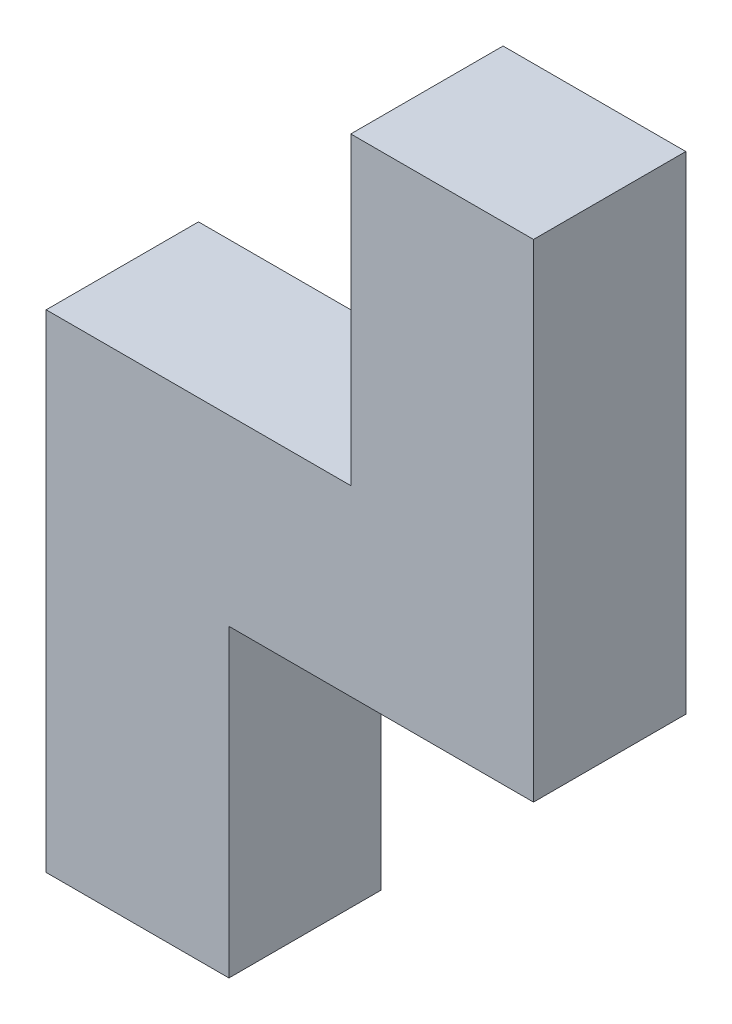
ISO-10303-21;
HEADER;
FILE_DESCRIPTION(('STEP AP214'),'2;1');
FILE_NAME('part.step','',(''),(''),'','','');
FILE_SCHEMA(('AUTOMOTIVE_DESIGN { 1 0 10303 214 1 1 1 1 }'));
ENDSEC;
DATA;
#1=APPLICATION_CONTEXT('core data for automotive mechanical design processes');
#2=APPLICATION_PROTOCOL_DEFINITION('international standard','automotive_design',2000,#1);
#3=PRODUCT_CONTEXT('',#1,'mechanical');
#4=PRODUCT('Part','Part','',(#3));
#5=PRODUCT_RELATED_PRODUCT_CATEGORY('part','',(#4));
#6=PRODUCT_DEFINITION_FORMATION('','',#4);
#7=PRODUCT_DEFINITION_CONTEXT('part definition',#1,'design');
#8=PRODUCT_DEFINITION('design','',#6,#7);
#9=PRODUCT_DEFINITION_SHAPE('','',#8);
#10=(LENGTH_UNIT() NAMED_UNIT(*) SI_UNIT(.MILLI.,.METRE.));
#11=(NAMED_UNIT(*) PLANE_ANGLE_UNIT() SI_UNIT($,.RADIAN.));
#12=(NAMED_UNIT(*) SI_UNIT($,.STERADIAN.) SOLID_ANGLE_UNIT());
#13=UNCERTAINTY_MEASURE_WITH_UNIT(LENGTH_MEASURE(1.E-05),#10,'distance_accuracy_value','');
#14=(GEOMETRIC_REPRESENTATION_CONTEXT(3) GLOBAL_UNCERTAINTY_ASSIGNED_CONTEXT((#13)) GLOBAL_UNIT_ASSIGNED_CONTEXT((#10,
#11,#12)) REPRESENTATION_CONTEXT('',''));
#15=CARTESIAN_POINT('',(0.,0.,0.));
#16=DIRECTION('',(0.,0.,1.));
#17=DIRECTION('',(1.,0.,0.));
#18=AXIS2_PLACEMENT_3D('',#15,#16,#17);
#19=CARTESIAN_POINT('',(0.,32.,-10.));
#20=DIRECTION('',(-1.,0.,0.));
#21=DIRECTION('',(0.,-1.,0.));
#22=AXIS2_PLACEMENT_3D('',#19,#20,#21);
#23=PLANE('',#22);
#24=DIRECTION('',(0.,-1.,0.));
#25=VECTOR('',#24,1.);
#26=CARTESIAN_POINT('',(0.,32.,0.));
#27=LINE('',#26,#25);
#28=CARTESIAN_POINT('',(0.,32.,0.));
#29=VERTEX_POINT('',#28);
#30=CARTESIAN_POINT('',(0.,0.,0.));
#31=VERTEX_POINT('',#30);
#32=EDGE_CURVE('E128',#29,#31,#27,.T.);
#33=ORIENTED_EDGE('',*,*,#32,.F.);
#34=DIRECTION('',(0.,0.,1.));
#35=VECTOR('',#34,1.);
#36=CARTESIAN_POINT('',(0.,32.,-10.));
#37=LINE('',#36,#35);
#38=CARTESIAN_POINT('',(0.,32.,-10.));
#39=VERTEX_POINT('',#38);
#40=EDGE_CURVE('E11',#39,#29,#37,.T.);
#41=ORIENTED_EDGE('',*,*,#40,.F.);
#42=DIRECTION('',(0.,-1.,0.));
#43=VECTOR('',#42,1.);
#44=CARTESIAN_POINT('',(0.,32.,-10.));
#45=LINE('',#44,#43);
#46=CARTESIAN_POINT('',(0.,0.,-10.));
#47=VERTEX_POINT('',#46);
#48=EDGE_CURVE('E148',#39,#47,#45,.T.);
#49=ORIENTED_EDGE('',*,*,#48,.T.);
#50=DIRECTION('',(0.,0.,1.));
#51=VECTOR('',#50,1.);
#52=CARTESIAN_POINT('',(0.,0.,-10.));
#53=LINE('',#52,#51);
#54=EDGE_CURVE('E34',#47,#31,#53,.T.);
#55=ORIENTED_EDGE('',*,*,#54,.T.);
#56=EDGE_LOOP('',(#33,#41,#49,#55));
#57=FACE_BOUND('',#56,.T.);
#58=ADVANCED_FACE('F31',(#57),#23,.T.);
#59=CARTESIAN_POINT('',(20.,32.,-10.));
#60=DIRECTION('',(0.,1.,0.));
#61=DIRECTION('',(0.,0.,1.));
#62=AXIS2_PLACEMENT_3D('',#59,#60,#61);
#63=PLANE('',#62);
#64=DIRECTION('',(-1.,0.,0.));
#65=VECTOR('',#64,1.);
#66=CARTESIAN_POINT('',(20.,32.,0.));
#67=LINE('',#66,#65);
#68=CARTESIAN_POINT('',(20.,32.,0.));
#69=VERTEX_POINT('',#68);
#70=EDGE_CURVE('E146',#69,#29,#67,.T.);
#71=ORIENTED_EDGE('',*,*,#70,.F.);
#72=DIRECTION('',(0.,0.,1.));
#73=VECTOR('',#72,1.);
#74=CARTESIAN_POINT('',(20.,32.,-10.));
#75=LINE('',#74,#73);
#76=CARTESIAN_POINT('',(20.,32.,-10.));
#77=VERTEX_POINT('',#76);
#78=EDGE_CURVE('E40',#77,#69,#75,.T.);
#79=ORIENTED_EDGE('',*,*,#78,.F.);
#80=DIRECTION('',(-1.,0.,0.));
#81=VECTOR('',#80,1.);
#82=CARTESIAN_POINT('',(20.,32.,-10.));
#83=LINE('',#82,#81);
#84=EDGE_CURVE('E118',#77,#39,#83,.T.);
#85=ORIENTED_EDGE('',*,*,#84,.T.);
#86=ORIENTED_EDGE('',*,*,#40,.T.);
#87=EDGE_LOOP('',(#71,#79,#85,#86));
#88=FACE_BOUND('',#87,.T.);
#89=ADVANCED_FACE('F160',(#88),#63,.T.);
#90=CARTESIAN_POINT('',(20.,52.,-10.));
#91=DIRECTION('',(-1.,0.,0.));
#92=DIRECTION('',(0.,-1.,0.));
#93=AXIS2_PLACEMENT_3D('',#90,#91,#92);
#94=PLANE('',#93);
#95=DIRECTION('',(0.,-1.,0.));
#96=VECTOR('',#95,1.);
#97=CARTESIAN_POINT('',(20.,52.,0.));
#98=LINE('',#97,#96);
#99=CARTESIAN_POINT('',(20.,52.,0.));
#100=VERTEX_POINT('',#99);
#101=EDGE_CURVE('E105',#100,#69,#98,.T.);
#102=ORIENTED_EDGE('',*,*,#101,.F.);
#103=DIRECTION('',(0.,0.,1.));
#104=VECTOR('',#103,1.);
#105=CARTESIAN_POINT('',(20.,52.,-10.));
#106=LINE('',#105,#104);
#107=CARTESIAN_POINT('',(20.,52.,-10.));
#108=VERTEX_POINT('',#107);
#109=EDGE_CURVE('E100',#108,#100,#106,.T.);
#110=ORIENTED_EDGE('',*,*,#109,.F.);
#111=DIRECTION('',(0.,-1.,0.));
#112=VECTOR('',#111,1.);
#113=CARTESIAN_POINT('',(20.,52.,-10.));
#114=LINE('',#113,#112);
#115=EDGE_CURVE('E103',#108,#77,#114,.T.);
#116=ORIENTED_EDGE('',*,*,#115,.T.);
#117=ORIENTED_EDGE('',*,*,#78,.T.);
#118=EDGE_LOOP('',(#102,#110,#116,#117));
#119=FACE_BOUND('',#118,.T.);
#120=ADVANCED_FACE('F102',(#119),#94,.T.);
#121=CARTESIAN_POINT('',(32.,52.,-10.));
#122=DIRECTION('',(0.,1.,0.));
#123=DIRECTION('',(-1.,0.,0.));
#124=AXIS2_PLACEMENT_3D('',#121,#122,#123);
#125=PLANE('',#124);
#126=DIRECTION('',(-1.,0.,0.));
#127=VECTOR('',#126,1.);
#128=CARTESIAN_POINT('',(32.,52.,0.));
#129=LINE('',#128,#127);
#130=CARTESIAN_POINT('',(32.,52.,0.));
#131=VERTEX_POINT('',#130);
#132=EDGE_CURVE('E143',#131,#100,#129,.T.);
#133=ORIENTED_EDGE('',*,*,#132,.F.);
#134=DIRECTION('',(0.,0.,1.));
#135=VECTOR('',#134,1.);
#136=CARTESIAN_POINT('',(32.,52.,-10.));
#137=LINE('',#136,#135);
#138=CARTESIAN_POINT('',(32.,52.,-10.));
#139=VERTEX_POINT('',#138);
#140=EDGE_CURVE('E110',#139,#131,#137,.T.);
#141=ORIENTED_EDGE('',*,*,#140,.F.);
#142=DIRECTION('',(-1.,0.,0.));
#143=VECTOR('',#142,1.);
#144=CARTESIAN_POINT('',(32.,52.,-10.));
#145=LINE('',#144,#143);
#146=EDGE_CURVE('E116',#139,#108,#145,.T.);
#147=ORIENTED_EDGE('',*,*,#146,.T.);
#148=ORIENTED_EDGE('',*,*,#109,.T.);
#149=EDGE_LOOP('',(#133,#141,#147,#148));
#150=FACE_BOUND('',#149,.T.);
#151=ADVANCED_FACE('F120',(#150),#125,.T.);
#152=CARTESIAN_POINT('',(32.,20.,-10.));
#153=DIRECTION('',(1.,0.,0.));
#154=DIRECTION('',(0.,0.,-1.));
#155=AXIS2_PLACEMENT_3D('',#152,#153,#154);
#156=PLANE('',#155);
#157=DIRECTION('',(0.,1.,0.));
#158=VECTOR('',#157,1.);
#159=CARTESIAN_POINT('',(32.,20.,0.));
#160=LINE('',#159,#158);
#161=CARTESIAN_POINT('',(32.,20.,0.));
#162=VERTEX_POINT('',#161);
#163=EDGE_CURVE('E140',#162,#131,#160,.T.);
#164=ORIENTED_EDGE('',*,*,#163,.F.);
#165=DIRECTION('',(0.,0.,1.));
#166=VECTOR('',#165,1.);
#167=CARTESIAN_POINT('',(32.,20.,-10.));
#168=LINE('',#167,#166);
#169=CARTESIAN_POINT('',(32.,20.,-10.));
#170=VERTEX_POINT('',#169);
#171=EDGE_CURVE('E152',#170,#162,#168,.T.);
#172=ORIENTED_EDGE('',*,*,#171,.F.);
#173=DIRECTION('',(0.,1.,0.));
#174=VECTOR('',#173,1.);
#175=CARTESIAN_POINT('',(32.,20.,-10.));
#176=LINE('',#175,#174);
#177=EDGE_CURVE('E121',#170,#139,#176,.T.);
#178=ORIENTED_EDGE('',*,*,#177,.T.);
#179=ORIENTED_EDGE('',*,*,#140,.T.);
#180=EDGE_LOOP('',(#164,#172,#178,#179));
#181=FACE_BOUND('',#180,.T.);
#182=ADVANCED_FACE('F173',(#181),#156,.T.);
#183=CARTESIAN_POINT('',(12.,20.,-10.));
#184=DIRECTION('',(0.,-1.,0.));
#185=DIRECTION('',(0.,0.,-1.));
#186=AXIS2_PLACEMENT_3D('',#183,#184,#185);
#187=PLANE('',#186);
#188=DIRECTION('',(1.,0.,0.));
#189=VECTOR('',#188,1.);
#190=CARTESIAN_POINT('',(12.,20.,0.));
#191=LINE('',#190,#189);
#192=CARTESIAN_POINT('',(12.,20.,0.));
#193=VERTEX_POINT('',#192);
#194=EDGE_CURVE('E137',#193,#162,#191,.T.);
#195=ORIENTED_EDGE('',*,*,#194,.F.);
#196=DIRECTION('',(0.,0.,1.));
#197=VECTOR('',#196,1.);
#198=CARTESIAN_POINT('',(12.,20.,-10.));
#199=LINE('',#198,#197);
#200=CARTESIAN_POINT('',(12.,20.,-10.));
#201=VERTEX_POINT('',#200);
#202=EDGE_CURVE('E154',#201,#193,#199,.T.);
#203=ORIENTED_EDGE('',*,*,#202,.F.);
#204=DIRECTION('',(1.,0.,0.));
#205=VECTOR('',#204,1.);
#206=CARTESIAN_POINT('',(12.,20.,-10.));
#207=LINE('',#206,#205);
#208=EDGE_CURVE('E123',#201,#170,#207,.T.);
#209=ORIENTED_EDGE('',*,*,#208,.T.);
#210=ORIENTED_EDGE('',*,*,#171,.T.);
#211=EDGE_LOOP('',(#195,#203,#209,#210));
#212=FACE_BOUND('',#211,.T.);
#213=ADVANCED_FACE('F176',(#212),#187,.T.);
#214=CARTESIAN_POINT('',(12.,0.,-10.));
#215=DIRECTION('',(1.,0.,0.));
#216=DIRECTION('',(0.,0.,-1.));
#217=AXIS2_PLACEMENT_3D('',#214,#215,#216);
#218=PLANE('',#217);
#219=DIRECTION('',(0.,1.,0.));
#220=VECTOR('',#219,1.);
#221=CARTESIAN_POINT('',(12.,0.,0.));
#222=LINE('',#221,#220);
#223=CARTESIAN_POINT('',(12.,0.,0.));
#224=VERTEX_POINT('',#223);
#225=EDGE_CURVE('E134',#224,#193,#222,.T.);
#226=ORIENTED_EDGE('',*,*,#225,.F.);
#227=DIRECTION('',(0.,0.,1.));
#228=VECTOR('',#227,1.);
#229=CARTESIAN_POINT('',(12.,0.,-10.));
#230=LINE('',#229,#228);
#231=CARTESIAN_POINT('',(12.,0.,-10.));
#232=VERTEX_POINT('',#231);
#233=EDGE_CURVE('E155',#232,#224,#230,.T.);
#234=ORIENTED_EDGE('',*,*,#233,.F.);
#235=DIRECTION('',(0.,1.,0.));
#236=VECTOR('',#235,1.);
#237=CARTESIAN_POINT('',(12.,0.,-10.));
#238=LINE('',#237,#236);
#239=EDGE_CURVE('E251',#232,#201,#238,.T.);
#240=ORIENTED_EDGE('',*,*,#239,.T.);
#241=ORIENTED_EDGE('',*,*,#202,.T.);
#242=EDGE_LOOP('',(#226,#234,#240,#241));
#243=FACE_BOUND('',#242,.T.);
#244=ADVANCED_FACE('F180',(#243),#218,.T.);
#245=CARTESIAN_POINT('',(0.,0.,-10.));
#246=DIRECTION('',(0.,-1.,0.));
#247=DIRECTION('',(0.,0.,-1.));
#248=AXIS2_PLACEMENT_3D('',#245,#246,#247);
#249=PLANE('',#248);
#250=DIRECTION('',(1.,0.,0.));
#251=VECTOR('',#250,1.);
#252=CARTESIAN_POINT('',(0.,0.,0.));
#253=LINE('',#252,#251);
#254=EDGE_CURVE('E131',#31,#224,#253,.T.);
#255=ORIENTED_EDGE('',*,*,#254,.F.);
#256=ORIENTED_EDGE('',*,*,#54,.F.);
#257=DIRECTION('',(1.,0.,0.));
#258=VECTOR('',#257,1.);
#259=CARTESIAN_POINT('',(0.,0.,-10.));
#260=LINE('',#259,#258);
#261=EDGE_CURVE('E252',#47,#232,#260,.T.);
#262=ORIENTED_EDGE('',*,*,#261,.T.);
#263=ORIENTED_EDGE('',*,*,#233,.T.);
#264=EDGE_LOOP('',(#255,#256,#262,#263));
#265=FACE_BOUND('',#264,.T.);
#266=ADVANCED_FACE('F157',(#265),#249,.T.);
#267=CARTESIAN_POINT('',(0.,0.,-10.));
#268=DIRECTION('',(0.,0.,1.));
#269=DIRECTION('',(1.,0.,0.));
#270=AXIS2_PLACEMENT_3D('',#267,#268,#269);
#271=PLANE('',#270);
#272=ORIENTED_EDGE('',*,*,#48,.F.);
#273=ORIENTED_EDGE('',*,*,#84,.F.);
#274=ORIENTED_EDGE('',*,*,#115,.F.);
#275=ORIENTED_EDGE('',*,*,#146,.F.);
#276=ORIENTED_EDGE('',*,*,#177,.F.);
#277=ORIENTED_EDGE('',*,*,#208,.F.);
#278=ORIENTED_EDGE('',*,*,#239,.F.);
#279=ORIENTED_EDGE('',*,*,#261,.F.);
#280=EDGE_LOOP('',(#272,#273,#274,#275,#276,#277,#278,#279));
#281=FACE_BOUND('',#280,.T.);
#282=ADVANCED_FACE('F114',(#281),#271,.F.);
#283=CARTESIAN_POINT('',(0.,0.,0.));
#284=DIRECTION('',(0.,0.,1.));
#285=DIRECTION('',(1.,0.,0.));
#286=AXIS2_PLACEMENT_3D('',#283,#284,#285);
#287=PLANE('',#286);
#288=ORIENTED_EDGE('',*,*,#32,.T.);
#289=ORIENTED_EDGE('',*,*,#254,.T.);
#290=ORIENTED_EDGE('',*,*,#225,.T.);
#291=ORIENTED_EDGE('',*,*,#194,.T.);
#292=ORIENTED_EDGE('',*,*,#163,.T.);
#293=ORIENTED_EDGE('',*,*,#132,.T.);
#294=ORIENTED_EDGE('',*,*,#101,.T.);
#295=ORIENTED_EDGE('',*,*,#70,.T.);
#296=EDGE_LOOP('',(#288,#289,#290,#291,#292,#293,#294,#295));
#297=FACE_BOUND('',#296,.T.);
#298=ADVANCED_FACE('F159',(#297),#287,.T.);
#299=CLOSED_SHELL('',(#58,#89,#120,#151,#182,#213,#244,#266,#282,#298));
#300=MANIFOLD_SOLID_BREP('B2',#299);
#301=ADVANCED_BREP_SHAPE_REPRESENTATION('',(#18,#300),#14);
#302=SHAPE_DEFINITION_REPRESENTATION(#9,#301);
ENDSEC;
END-ISO-10303-21;
